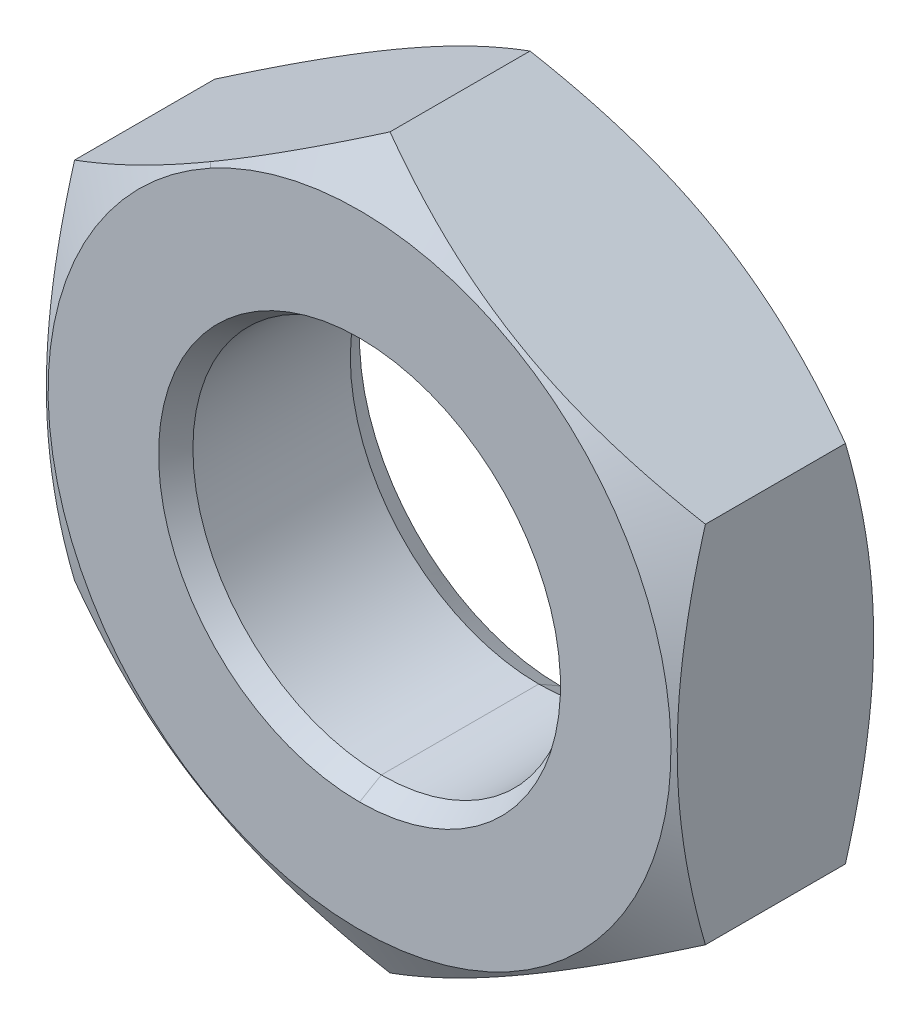
ISO-10303-21;
HEADER;
FILE_DESCRIPTION(('STEP AP214'),'2;1');
FILE_NAME('part.step','',(''),(''),'','','');
FILE_SCHEMA(('AUTOMOTIVE_DESIGN { 1 0 10303 214 1 1 1 1 }'));
ENDSEC;
DATA;
#1=APPLICATION_CONTEXT('core data for automotive mechanical design processes');
#2=APPLICATION_PROTOCOL_DEFINITION('international standard','automotive_design',2000,#1);
#3=PRODUCT_CONTEXT('',#1,'mechanical');
#4=PRODUCT('Part','Part','',(#3));
#5=PRODUCT_RELATED_PRODUCT_CATEGORY('part','',(#4));
#6=PRODUCT_DEFINITION_FORMATION('','',#4);
#7=PRODUCT_DEFINITION_CONTEXT('part definition',#1,'design');
#8=PRODUCT_DEFINITION('design','',#6,#7);
#9=PRODUCT_DEFINITION_SHAPE('','',#8);
#10=(LENGTH_UNIT() NAMED_UNIT(*) SI_UNIT(.MILLI.,.METRE.));
#11=(NAMED_UNIT(*) PLANE_ANGLE_UNIT() SI_UNIT($,.RADIAN.));
#12=(NAMED_UNIT(*) SI_UNIT($,.STERADIAN.) SOLID_ANGLE_UNIT());
#13=UNCERTAINTY_MEASURE_WITH_UNIT(LENGTH_MEASURE(1.E-05),#10,'distance_accuracy_value','');
#14=(GEOMETRIC_REPRESENTATION_CONTEXT(3) GLOBAL_UNCERTAINTY_ASSIGNED_CONTEXT((#13)) GLOBAL_UNIT_ASSIGNED_CONTEXT((#10,
#11,#12)) REPRESENTATION_CONTEXT('',''));
#15=CARTESIAN_POINT('',(0.,0.,0.));
#16=DIRECTION('',(0.,0.,1.));
#17=DIRECTION('',(1.,0.,0.));
#18=AXIS2_PLACEMENT_3D('',#15,#16,#17);
#19=CARTESIAN_POINT('',(0.,0.,-0.8));
#20=DIRECTION('',(0.,0.,1.));
#21=DIRECTION('',(0.479425538604204,-0.877582561890372,0.));
#22=AXIS2_PLACEMENT_3D('',#19,#20,#21);
#23=CONICAL_SURFACE('',#22,2.48001594543,1.0471975512);
#24=CARTESIAN_POINT('',(2.51147367097,1.45,-0.557522093041));
#25=CARTESIAN_POINT('',(2.36141365323,1.53663719164,-0.607542098957));
#26=CARTESIAN_POINT('',(2.2114641529,1.62321057602,-0.651921449576));
#27=CARTESIAN_POINT('',(2.06213640956,1.70942498883,-0.689677750509));
#28=CARTESIAN_POINT('',(1.73319740752,1.89933801021,-0.756854752286));
#29=CARTESIAN_POINT('',(1.40737507889,2.08745161935,-0.785622243016));
#30=CARTESIAN_POINT('',(1.2294714031,2.19016435446,-0.789092730585));
#31=CARTESIAN_POINT('',(0.88963986871,2.38636618232,-0.772120273088));
#32=CARTESIAN_POINT('',(0.546895461987,2.5842497578,-0.712167724603));
#33=CARTESIAN_POINT('',(0.383075275367,2.67883138665,-0.67438001871));
#34=CARTESIAN_POINT('',(0.207665931972,2.78010401827,-0.625244862792));
#35=CARTESIAN_POINT('',(0.0320039125033,2.8815225325,-0.568104794491));
#36=CARTESIAN_POINT('',(0.0213360603002,2.88768161984,-0.56460578976));
#37=CARTESIAN_POINT('',(0.0106683094443,2.89384064867,-0.561078196189));
#38=CARTESIAN_POINT('',(0.,2.9,-0.557522093041));
#39=(BOUNDED_CURVE() B_SPLINE_CURVE(5,(#24,#25,#26,#27,#28,#29,#30,#31,#32,#33,#34,#35,#36,#37,
#38),.UNSPECIFIED.,.F.,.F.) B_SPLINE_CURVE_WITH_KNOTS((6,3,3,3,6),(0.,1.2440758692,
2.75181323299,4.11997717548,4.20842302897),
.UNSPECIFIED.) CURVE() GEOMETRIC_REPRESENTATION_ITEM() RATIONAL_B_SPLINE_CURVE((1.,1.,1.,1.,1.,
1.,1.,1.,1.,1.,1.,1.,1.,1.,1.)) REPRESENTATION_ITEM(''));
#40=CARTESIAN_POINT('',(2.51147367097,1.45,-0.557522093041));
#41=VERTEX_POINT('',#40);
#42=CARTESIAN_POINT('',(0.,2.9,-0.557522093041));
#43=VERTEX_POINT('',#42);
#44=EDGE_CURVE('E259',#41,#43,#39,.T.);
#45=ORIENTED_EDGE('',*,*,#44,.F.);
#46=CARTESIAN_POINT('',(2.51147367097,-1.45,-0.557522093041));
#47=CARTESIAN_POINT('',(2.51147367097,-1.27672561672,-0.607542098958));
#48=CARTESIAN_POINT('',(2.51147367097,-1.10357884796,-0.651921449576));
#49=CARTESIAN_POINT('',(2.51147367097,-0.931150022338,-0.689677750509));
#50=CARTESIAN_POINT('',(2.51147367097,-0.551323979578,-0.756854752285));
#51=CARTESIAN_POINT('',(2.51147367097,-0.17509676129,-0.785622243016));
#52=CARTESIAN_POINT('',(2.51147367097,0.0303287089164,-0.789092730585));
#53=CARTESIAN_POINT('',(2.51147367097,0.422732364635,-0.772120273089));
#54=CARTESIAN_POINT('',(2.51147367097,0.818499515605,-0.712167724603));
#55=CARTESIAN_POINT('',(2.51147367097,1.0076627733,-0.674380018709));
#56=CARTESIAN_POINT('',(2.51147367097,1.21020803655,-0.625244862792));
#57=CARTESIAN_POINT('',(2.51147367097,1.413045065,-0.568104794491));
#58=CARTESIAN_POINT('',(2.51147367097,1.42536323968,-0.56460578976));
#59=CARTESIAN_POINT('',(2.51147367097,1.43768129734,-0.561078196189));
#60=CARTESIAN_POINT('',(2.51147367097,1.45,-0.557522093041));
#61=(BOUNDED_CURVE() B_SPLINE_CURVE(5,(#46,#47,#48,#49,#50,#51,#52,#53,#54,#55,#56,#57,#58,#59,
#60),.UNSPECIFIED.,.F.,.F.) B_SPLINE_CURVE_WITH_KNOTS((6,3,3,3,6),(0.,1.24407586921,
2.75181323301,4.11997717548,4.20842302897),
.UNSPECIFIED.) CURVE() GEOMETRIC_REPRESENTATION_ITEM() RATIONAL_B_SPLINE_CURVE((1.,1.,1.,1.,1.,
1.,1.,1.,1.,1.,1.,1.,1.,1.,1.)) REPRESENTATION_ITEM(''));
#62=CARTESIAN_POINT('',(2.51147367097,-1.45,-0.557522093041));
#63=VERTEX_POINT('',#62);
#64=EDGE_CURVE('E245',#63,#41,#61,.T.);
#65=ORIENTED_EDGE('',*,*,#64,.F.);
#66=CARTESIAN_POINT('',(1.20439996834,-2.20463935407,-0.78143402588));
#67=CARTESIAN_POINT('',(1.36655578818,-2.11101864783,-0.783984908302));
#68=CARTESIAN_POINT('',(1.52860758409,-2.01745799984,-0.776468041161));
#69=CARTESIAN_POINT('',(1.69110113891,-1.92364230223,-0.758832467991));
#70=CARTESIAN_POINT('',(1.95221602436,-1.77288755282,-0.715073455665));
#71=CARTESIAN_POINT('',(2.21530966673,-1.62099036757,-0.648720983586));
#72=CARTESIAN_POINT('',(2.31390385682,-1.56406698539,-0.62094903655));
#73=CARTESIAN_POINT('',(2.41266480523,-1.50704732523,-0.590458381621));
#74=CARTESIAN_POINT('',(2.51147367097,-1.45,-0.557522093041));
#75=(BOUNDED_CURVE() B_SPLINE_CURVE(5,(#66,#67,#68,#69,#70,#71,#72,#73,#74),.UNSPECIFIED.,.F.,
.F.) B_SPLINE_CURVE_WITH_KNOTS((6,3,6),(0.,1.37175235219,2.19092942131),
.UNSPECIFIED.) CURVE() GEOMETRIC_REPRESENTATION_ITEM() RATIONAL_B_SPLINE_CURVE((1.,1.,1.,1.,1.,
1.,1.,1.,1.)) REPRESENTATION_ITEM(''));
#76=CARTESIAN_POINT('',(1.20439996834,-2.20463935407,-0.78143402588));
#77=VERTEX_POINT('',#76);
#78=EDGE_CURVE('E116',#77,#63,#75,.T.);
#79=ORIENTED_EDGE('',*,*,#78,.F.);
#80=DIRECTION('',(0.41519469565414,-0.760008792515256,0.500000000000169));
#81=VECTOR('',#80,1.);
#82=CARTESIAN_POINT('',(1.28965852117,-2.3607040882,-0.678761046521));
#83=LINE('',#82,#81);
#84=CARTESIAN_POINT('',(1.18898298039,-2.17641874692,-0.8));
#85=VERTEX_POINT('',#84);
#86=EDGE_CURVE('E10',#85,#77,#83,.T.);
#87=ORIENTED_EDGE('',*,*,#86,.F.);
#88=CARTESIAN_POINT('',(0.,0.,-0.8));
#89=DIRECTION('',(0.,0.,1.));
#90=DIRECTION('',(1.,0.,0.));
#91=AXIS2_PLACEMENT_3D('',#88,#89,#90);
#92=CIRCLE('',#91,2.48001594543);
#93=CARTESIAN_POINT('',(-1.18898298039,2.17641874692,-0.8));
#94=VERTEX_POINT('',#93);
#95=EDGE_CURVE('E203',#85,#94,#92,.T.);
#96=ORIENTED_EDGE('',*,*,#95,.T.);
#97=DIRECTION('',(-0.41519469565414,0.760008792515256,0.500000000000169));
#98=VECTOR('',#97,1.);
#99=CARTESIAN_POINT('',(-1.28965852117,2.3607040882,-0.678761046521));
#100=LINE('',#99,#98);
#101=CARTESIAN_POINT('',(-1.20439996834,2.20463935407,-0.78143402588));
#102=VERTEX_POINT('',#101);
#103=EDGE_CURVE('E29',#94,#102,#100,.T.);
#104=ORIENTED_EDGE('',*,*,#103,.T.);
#105=CARTESIAN_POINT('',(-1.20439996834,2.20463935407,-0.78143402588));
#106=CARTESIAN_POINT('',(-1.03081716587,2.3048574318,-0.778703384944));
#107=CARTESIAN_POINT('',(-0.857115276609,2.40514426432,-0.764436072395));
#108=CARTESIAN_POINT('',(-0.682719638759,2.50583163278,-0.738710403924));
#109=CARTESIAN_POINT('',(-0.441318736488,2.64520450869,-0.688485383347));
#110=CARTESIAN_POINT('',(-0.198548844611,2.78536777112,-0.620361295045));
#111=CARTESIAN_POINT('',(-0.132409033146,2.82355360907,-0.600567323045));
#112=CARTESIAN_POINT('',(-0.0662152759507,2.86177059261,-0.579593851692));
#113=CARTESIAN_POINT('',(0.,2.9,-0.557522093041));
#114=(BOUNDED_CURVE() B_SPLINE_CURVE(5,(#105,#106,#107,#108,#109,#110,#111,#112,#113),
.UNSPECIFIED.,.F.,.F.) B_SPLINE_CURVE_WITH_KNOTS((6,3,6),(0.,1.46841857306,2.01737777098),
.UNSPECIFIED.) CURVE() GEOMETRIC_REPRESENTATION_ITEM() RATIONAL_B_SPLINE_CURVE((1.,1.,1.,1.,1.,
1.,1.,1.,1.)) REPRESENTATION_ITEM(''));
#115=EDGE_CURVE('E172',#102,#43,#114,.T.);
#116=ORIENTED_EDGE('',*,*,#115,.T.);
#117=EDGE_LOOP('',(#45,#65,#79,#87,#96,#104,#116));
#118=FACE_BOUND('',#117,.T.);
#119=ADVANCED_FACE('F18',(#118),#23,.T.);
#120=CARTESIAN_POINT('',(0.,0.,-0.8));
#121=DIRECTION('',(0.,0.,1.));
#122=DIRECTION('',(0.479425538604204,-0.877582561890372,0.));
#123=AXIS2_PLACEMENT_3D('',#120,#121,#122);
#124=CONICAL_SURFACE('',#123,2.48001594543,1.0471975512);
#125=CARTESIAN_POINT('',(-2.51147367097,-1.45,-0.557522093041));
#126=CARTESIAN_POINT('',(-2.36141365323,-1.53663719164,-0.607542098957));
#127=CARTESIAN_POINT('',(-2.2114641529,-1.62321057602,-0.651921449576));
#128=CARTESIAN_POINT('',(-2.06213640957,-1.70942498883,-0.689677750509));
#129=CARTESIAN_POINT('',(-1.73319740752,-1.89933801021,-0.756854752285));
#130=CARTESIAN_POINT('',(-1.40737507889,-2.08745161935,-0.785622243016));
#131=CARTESIAN_POINT('',(-1.2294714031,-2.19016435446,-0.789092730585));
#132=CARTESIAN_POINT('',(-0.889639868711,-2.38636618232,-0.772120273088));
#133=CARTESIAN_POINT('',(-0.546895461988,-2.5842497578,-0.712167724604));
#134=CARTESIAN_POINT('',(-0.383075275365,-2.67883138665,-0.674380018709));
#135=CARTESIAN_POINT('',(-0.207665931971,-2.78010401828,-0.625244862792));
#136=CARTESIAN_POINT('',(-0.0320039125033,-2.8815225325,-0.568104794491));
#137=CARTESIAN_POINT('',(-0.0213360603002,-2.88768161984,-0.56460578976));
#138=CARTESIAN_POINT('',(-0.0106683094443,-2.89384064867,-0.561078196189));
#139=CARTESIAN_POINT('',(0.,-2.9,-0.557522093041));
#140=(BOUNDED_CURVE() B_SPLINE_CURVE(5,(#125,#126,#127,#128,#129,#130,#131,#132,#133,#134,#135,
#136,#137,#138,#139),.UNSPECIFIED.,.F.,.F.) B_SPLINE_CURVE_WITH_KNOTS((6,3,3,3,6),(0.,
1.24407586921,2.751813233,4.11997717547,4.20842302896),
.UNSPECIFIED.) CURVE() GEOMETRIC_REPRESENTATION_ITEM() RATIONAL_B_SPLINE_CURVE((1.,1.,1.,1.,1.,
1.,1.,1.,1.,1.,1.,1.,1.,1.,1.)) REPRESENTATION_ITEM(''));
#141=CARTESIAN_POINT('',(-2.51147367097,-1.45,-0.557522093041));
#142=VERTEX_POINT('',#141);
#143=CARTESIAN_POINT('',(0.,-2.9,-0.557522093041));
#144=VERTEX_POINT('',#143);
#145=EDGE_CURVE('E211',#142,#144,#140,.T.);
#146=ORIENTED_EDGE('',*,*,#145,.F.);
#147=CARTESIAN_POINT('',(-2.51147367097,1.45,-0.557522093041));
#148=CARTESIAN_POINT('',(-2.51147367097,1.27672561671,-0.607542098958));
#149=CARTESIAN_POINT('',(-2.51147367097,1.10357884795,-0.651921449578));
#150=CARTESIAN_POINT('',(-2.51147367097,0.931150022343,-0.689677750508));
#151=CARTESIAN_POINT('',(-2.51147367097,0.551323979579,-0.756854752286));
#152=CARTESIAN_POINT('',(-2.51147367097,0.175096761286,-0.785622243017));
#153=CARTESIAN_POINT('',(-2.51147367097,-0.0303287089125,-0.789092730585));
#154=CARTESIAN_POINT('',(-2.51147367097,-0.422732364642,-0.772120273089));
#155=CARTESIAN_POINT('',(-2.51147367097,-0.818499515621,-0.7121677246));
#156=CARTESIAN_POINT('',(-2.51147367097,-1.00766277328,-0.674380018713));
#157=CARTESIAN_POINT('',(-2.51147367097,-1.21020803654,-0.625244862794));
#158=CARTESIAN_POINT('',(-2.51147367097,-1.413045065,-0.568104794491));
#159=CARTESIAN_POINT('',(-2.51147367097,-1.42536323968,-0.56460578976));
#160=CARTESIAN_POINT('',(-2.51147367097,-1.43768129734,-0.561078196189));
#161=CARTESIAN_POINT('',(-2.51147367097,-1.45,-0.557522093041));
#162=(BOUNDED_CURVE() B_SPLINE_CURVE(5,(#147,#148,#149,#150,#151,#152,#153,#154,#155,#156,#157,
#158,#159,#160,#161),.UNSPECIFIED.,.F.,.F.) B_SPLINE_CURVE_WITH_KNOTS((6,3,3,3,6),(0.,
1.24407586923,2.75181323304,4.11997717557,4.20842302906),
.UNSPECIFIED.) CURVE() GEOMETRIC_REPRESENTATION_ITEM() RATIONAL_B_SPLINE_CURVE((1.,1.,1.,1.,1.,
1.,1.,1.,1.,1.,1.,1.,1.,1.,1.)) REPRESENTATION_ITEM(''));
#163=CARTESIAN_POINT('',(-2.51147367097,1.45,-0.557522093041));
#164=VERTEX_POINT('',#163);
#165=EDGE_CURVE('E179',#164,#142,#162,.T.);
#166=ORIENTED_EDGE('',*,*,#165,.F.);
#167=CARTESIAN_POINT('',(-1.20439996834,2.20463935407,-0.78143402588));
#168=CARTESIAN_POINT('',(-1.36655578818,2.11101864783,-0.783984908302));
#169=CARTESIAN_POINT('',(-1.52860758409,2.01745799984,-0.776468041161));
#170=CARTESIAN_POINT('',(-1.6911011389,1.92364230223,-0.758832467991));
#171=CARTESIAN_POINT('',(-1.95221602436,1.77288755282,-0.715073455665));
#172=CARTESIAN_POINT('',(-2.21530966673,1.62099036757,-0.648720983586));
#173=CARTESIAN_POINT('',(-2.31390385682,1.56406698539,-0.62094903655));
#174=CARTESIAN_POINT('',(-2.41266480523,1.50704732523,-0.590458381621));
#175=CARTESIAN_POINT('',(-2.51147367097,1.45,-0.557522093041));
#176=(BOUNDED_CURVE() B_SPLINE_CURVE(5,(#167,#168,#169,#170,#171,#172,#173,#174,#175),
.UNSPECIFIED.,.F.,.F.) B_SPLINE_CURVE_WITH_KNOTS((6,3,6),(0.,1.3717523522,2.19092942132),
.UNSPECIFIED.) CURVE() GEOMETRIC_REPRESENTATION_ITEM() RATIONAL_B_SPLINE_CURVE((1.,1.,1.,1.,1.,
1.,1.,1.,1.)) REPRESENTATION_ITEM(''));
#177=EDGE_CURVE('E153',#102,#164,#176,.T.);
#178=ORIENTED_EDGE('',*,*,#177,.F.);
#179=ORIENTED_EDGE('',*,*,#103,.F.);
#180=CARTESIAN_POINT('',(0.,0.,-0.8));
#181=DIRECTION('',(0.,0.,1.));
#182=DIRECTION('',(1.,0.,0.));
#183=AXIS2_PLACEMENT_3D('',#180,#181,#182);
#184=CIRCLE('',#183,2.48001594543);
#185=EDGE_CURVE('E190',#94,#85,#184,.T.);
#186=ORIENTED_EDGE('',*,*,#185,.T.);
#187=ORIENTED_EDGE('',*,*,#86,.T.);
#188=CARTESIAN_POINT('',(1.20439996834,-2.20463935407,-0.78143402588));
#189=CARTESIAN_POINT('',(1.03081716587,-2.3048574318,-0.778703384944));
#190=CARTESIAN_POINT('',(0.857115276612,-2.40514426432,-0.764436072396));
#191=CARTESIAN_POINT('',(0.682719638755,-2.50583163278,-0.738710403923));
#192=CARTESIAN_POINT('',(0.441318736486,-2.64520450869,-0.688485383346));
#193=CARTESIAN_POINT('',(0.19854884461,-2.78536777112,-0.620361295045));
#194=CARTESIAN_POINT('',(0.132409033147,-2.82355360907,-0.600567323046));
#195=CARTESIAN_POINT('',(0.0662152759512,-2.86177059261,-0.579593851692));
#196=CARTESIAN_POINT('',(0.,-2.9,-0.557522093041));
#197=(BOUNDED_CURVE() B_SPLINE_CURVE(5,(#188,#189,#190,#191,#192,#193,#194,#195,#196),
.UNSPECIFIED.,.F.,.F.) B_SPLINE_CURVE_WITH_KNOTS((6,3,6),(0.,1.46841857305,2.01737777097),
.UNSPECIFIED.) CURVE() GEOMETRIC_REPRESENTATION_ITEM() RATIONAL_B_SPLINE_CURVE((1.,1.,1.,1.,1.,
1.,1.,1.,1.)) REPRESENTATION_ITEM(''));
#198=EDGE_CURVE('E237',#77,#144,#197,.T.);
#199=ORIENTED_EDGE('',*,*,#198,.T.);
#200=EDGE_LOOP('',(#146,#166,#178,#179,#186,#187,#199));
#201=FACE_BOUND('',#200,.T.);
#202=ADVANCED_FACE('F341',(#201),#124,.T.);
#203=CARTESIAN_POINT('',(0.,0.,0.8));
#204=DIRECTION('',(0.,0.,-1.));
#205=DIRECTION('',(0.479425538604204,-0.877582561890372,0.));
#206=AXIS2_PLACEMENT_3D('',#203,#204,#205);
#207=CONICAL_SURFACE('',#206,2.48001594543,1.0471975512);
#208=CARTESIAN_POINT('',(2.51147367097,-1.45,0.557522093041));
#209=CARTESIAN_POINT('',(2.51147367097,-1.27672561672,0.607542098957));
#210=CARTESIAN_POINT('',(2.51147367097,-1.10357884796,0.651921449576));
#211=CARTESIAN_POINT('',(2.51147367097,-0.931150022336,0.689677750509));
#212=CARTESIAN_POINT('',(2.51147367097,-0.551323979577,0.756854752286));
#213=CARTESIAN_POINT('',(2.51147367097,-0.175096761288,0.785622243016));
#214=CARTESIAN_POINT('',(2.51147367097,0.0303287089153,0.789092730585));
#215=CARTESIAN_POINT('',(2.51147367097,0.422732364637,0.772120273089));
#216=CARTESIAN_POINT('',(2.51147367097,0.81849951561,0.712167724602));
#217=CARTESIAN_POINT('',(2.51147367097,1.00766277329,0.67438001871));
#218=CARTESIAN_POINT('',(2.51147367097,1.21020803655,0.625244862793));
#219=CARTESIAN_POINT('',(2.51147367097,1.413045065,0.568104794491));
#220=CARTESIAN_POINT('',(2.51147367097,1.42536323968,0.56460578976));
#221=CARTESIAN_POINT('',(2.51147367097,1.43768129734,0.561078196189));
#222=CARTESIAN_POINT('',(2.51147367097,1.45,0.557522093041));
#223=(BOUNDED_CURVE() B_SPLINE_CURVE(5,(#208,#209,#210,#211,#212,#213,#214,#215,#216,#217,#218,
#219,#220,#221,#222),.UNSPECIFIED.,.F.,.F.) B_SPLINE_CURVE_WITH_KNOTS((6,3,3,3,6),(0.,
1.2440758692,2.751813233,4.1199771755,4.20842302899),
.UNSPECIFIED.) CURVE() GEOMETRIC_REPRESENTATION_ITEM() RATIONAL_B_SPLINE_CURVE((1.,1.,1.,1.,1.,
1.,1.,1.,1.,1.,1.,1.,1.,1.,1.)) REPRESENTATION_ITEM(''));
#224=CARTESIAN_POINT('',(2.51147367097,-1.45,0.557522093041));
#225=VERTEX_POINT('',#224);
#226=CARTESIAN_POINT('',(2.51147367097,1.45,0.557522093041));
#227=VERTEX_POINT('',#226);
#228=EDGE_CURVE('E238',#225,#227,#223,.T.);
#229=ORIENTED_EDGE('',*,*,#228,.T.);
#230=CARTESIAN_POINT('',(2.51147367097,1.45,0.557522093041));
#231=CARTESIAN_POINT('',(2.36141365323,1.53663719164,0.607542098958));
#232=CARTESIAN_POINT('',(2.2114641529,1.62321057602,0.651921449577));
#233=CARTESIAN_POINT('',(2.06213640957,1.70942498883,0.689677750508));
#234=CARTESIAN_POINT('',(1.73319740752,1.89933801021,0.756854752285));
#235=CARTESIAN_POINT('',(1.40737507888,2.08745161936,0.785622243016));
#236=CARTESIAN_POINT('',(1.2294714031,2.19016435446,0.789092730585));
#237=CARTESIAN_POINT('',(0.889639868708,2.38636618232,0.772120273088));
#238=CARTESIAN_POINT('',(0.54689546198,2.58424975781,0.712167724602));
#239=CARTESIAN_POINT('',(0.383075275373,2.67883138664,0.674380018711));
#240=CARTESIAN_POINT('',(0.207665931975,2.78010401827,0.625244862793));
#241=CARTESIAN_POINT('',(0.0320039125033,2.8815225325,0.568104794491));
#242=CARTESIAN_POINT('',(0.0213360603002,2.88768161984,0.56460578976));
#243=CARTESIAN_POINT('',(0.0106683094443,2.89384064867,0.561078196189));
#244=CARTESIAN_POINT('',(0.,2.9,0.557522093041));
#245=(BOUNDED_CURVE() B_SPLINE_CURVE(5,(#230,#231,#232,#233,#234,#235,#236,#237,#238,#239,#240,
#241,#242,#243,#244),.UNSPECIFIED.,.F.,.F.) B_SPLINE_CURVE_WITH_KNOTS((6,3,3,3,6),(0.,
1.24407586922,2.75181323302,4.11997717553,4.20842302902),
.UNSPECIFIED.) CURVE() GEOMETRIC_REPRESENTATION_ITEM() RATIONAL_B_SPLINE_CURVE((1.,1.,1.,1.,1.,
1.,1.,1.,1.,1.,1.,1.,1.,1.,1.)) REPRESENTATION_ITEM(''));
#246=CARTESIAN_POINT('',(0.,2.9,0.557522093041));
#247=VERTEX_POINT('',#246);
#248=EDGE_CURVE('E246',#227,#247,#245,.T.);
#249=ORIENTED_EDGE('',*,*,#248,.T.);
#250=CARTESIAN_POINT('',(-1.20439996834,2.20463935407,0.78143402588));
#251=CARTESIAN_POINT('',(-1.03081716587,2.3048574318,0.778703384944));
#252=CARTESIAN_POINT('',(-0.857115276613,2.40514426432,0.764436072396));
#253=CARTESIAN_POINT('',(-0.682719638754,2.50583163278,0.738710403922));
#254=CARTESIAN_POINT('',(-0.441318736485,2.64520450869,0.688485383346));
#255=CARTESIAN_POINT('',(-0.19854884461,2.78536777112,0.620361295045));
#256=CARTESIAN_POINT('',(-0.132409033148,2.82355360907,0.600567323046));
#257=CARTESIAN_POINT('',(-0.0662152759514,2.86177059261,0.579593851692));
#258=CARTESIAN_POINT('',(0.,2.9,0.557522093041));
#259=(BOUNDED_CURVE() B_SPLINE_CURVE(5,(#250,#251,#252,#253,#254,#255,#256,#257,#258),
.UNSPECIFIED.,.F.,.F.) B_SPLINE_CURVE_WITH_KNOTS((6,3,6),(0.,1.46841857304,2.01737777097),
.UNSPECIFIED.) CURVE() GEOMETRIC_REPRESENTATION_ITEM() RATIONAL_B_SPLINE_CURVE((1.,1.,1.,1.,1.,
1.,1.,1.,1.)) REPRESENTATION_ITEM(''));
#260=CARTESIAN_POINT('',(-1.20439996834,2.20463935407,0.78143402588));
#261=VERTEX_POINT('',#260);
#262=EDGE_CURVE('E164',#261,#247,#259,.T.);
#263=ORIENTED_EDGE('',*,*,#262,.F.);
#264=DIRECTION('',(0.41519469565414,-0.760008792515256,0.500000000000169));
#265=VECTOR('',#264,1.);
#266=CARTESIAN_POINT('',(-1.28965852117,2.3607040882,0.678761046521));
#267=LINE('',#266,#265);
#268=CARTESIAN_POINT('',(-1.18898298039,2.17641874692,0.8));
#269=VERTEX_POINT('',#268);
#270=EDGE_CURVE('E43',#261,#269,#267,.T.);
#271=ORIENTED_EDGE('',*,*,#270,.T.);
#272=CARTESIAN_POINT('',(0.,0.,0.8));
#273=DIRECTION('',(0.,0.,1.));
#274=DIRECTION('',(1.,0.,0.));
#275=AXIS2_PLACEMENT_3D('',#272,#273,#274);
#276=CIRCLE('',#275,2.48001594543);
#277=CARTESIAN_POINT('',(1.18898298039,-2.17641874692,0.8));
#278=VERTEX_POINT('',#277);
#279=EDGE_CURVE('E226',#278,#269,#276,.T.);
#280=ORIENTED_EDGE('',*,*,#279,.F.);
#281=DIRECTION('',(-0.41519469565414,0.760008792515256,0.500000000000169));
#282=VECTOR('',#281,1.);
#283=CARTESIAN_POINT('',(1.28965852117,-2.3607040882,0.678761046521));
#284=LINE('',#283,#282);
#285=CARTESIAN_POINT('',(1.20439996834,-2.20463935407,0.78143402588));
#286=VERTEX_POINT('',#285);
#287=EDGE_CURVE('E260',#286,#278,#284,.T.);
#288=ORIENTED_EDGE('',*,*,#287,.F.);
#289=CARTESIAN_POINT('',(1.20439996834,-2.20463935407,0.78143402588));
#290=CARTESIAN_POINT('',(1.36655578817,-2.11101864784,0.783984908302));
#291=CARTESIAN_POINT('',(1.52860758408,-2.01745799984,0.776468041162));
#292=CARTESIAN_POINT('',(1.69110113891,-1.92364230222,0.75883246799));
#293=CARTESIAN_POINT('',(1.95221602437,-1.77288755282,0.715073455664));
#294=CARTESIAN_POINT('',(2.21530966673,-1.62099036757,0.648720983586));
#295=CARTESIAN_POINT('',(2.31390385682,-1.56406698538,0.62094903655));
#296=CARTESIAN_POINT('',(2.41266480524,-1.50704732523,0.590458381621));
#297=CARTESIAN_POINT('',(2.51147367097,-1.45,0.557522093041));
#298=(BOUNDED_CURVE() B_SPLINE_CURVE(5,(#289,#290,#291,#292,#293,#294,#295,#296,#297),
.UNSPECIFIED.,.F.,.F.) B_SPLINE_CURVE_WITH_KNOTS((6,3,6),(0.,1.37175235216,2.19092942127),
.UNSPECIFIED.) CURVE() GEOMETRIC_REPRESENTATION_ITEM() RATIONAL_B_SPLINE_CURVE((1.,1.,1.,1.,1.,
1.,1.,1.,1.)) REPRESENTATION_ITEM(''));
#299=EDGE_CURVE('E127',#286,#225,#298,.T.);
#300=ORIENTED_EDGE('',*,*,#299,.T.);
#301=EDGE_LOOP('',(#229,#249,#263,#271,#280,#288,#300));
#302=FACE_BOUND('',#301,.T.);
#303=ADVANCED_FACE('F409',(#302),#207,.T.);
#304=CARTESIAN_POINT('',(0.,0.,0.8));
#305=DIRECTION('',(0.,0.,-1.));
#306=DIRECTION('',(0.479425538604204,-0.877582561890372,0.));
#307=AXIS2_PLACEMENT_3D('',#304,#305,#306);
#308=CONICAL_SURFACE('',#307,2.48001594543,1.0471975512);
#309=CARTESIAN_POINT('',(-2.51147367097,1.45,0.557522093041));
#310=CARTESIAN_POINT('',(-2.51147367097,1.27672561672,0.607542098957));
#311=CARTESIAN_POINT('',(-2.51147367097,1.10357884796,0.651921449576));
#312=CARTESIAN_POINT('',(-2.51147367097,0.931150022338,0.689677750509));
#313=CARTESIAN_POINT('',(-2.51147367097,0.55132397958,0.756854752285));
#314=CARTESIAN_POINT('',(-2.51147367097,0.175096761293,0.785622243016));
#315=CARTESIAN_POINT('',(-2.51147367097,-0.0303287089202,0.789092730585));
#316=CARTESIAN_POINT('',(-2.51147367097,-0.422732364641,0.772120273088));
#317=CARTESIAN_POINT('',(-2.51147367097,-0.818499515613,0.712167724602));
#318=CARTESIAN_POINT('',(-2.51147367097,-1.00766277329,0.674380018711));
#319=CARTESIAN_POINT('',(-2.51147367097,-1.21020803655,0.625244862793));
#320=CARTESIAN_POINT('',(-2.51147367097,-1.413045065,0.568104794491));
#321=CARTESIAN_POINT('',(-2.51147367097,-1.42536323968,0.56460578976));
#322=CARTESIAN_POINT('',(-2.51147367097,-1.43768129734,0.561078196189));
#323=CARTESIAN_POINT('',(-2.51147367097,-1.45,0.557522093041));
#324=(BOUNDED_CURVE() B_SPLINE_CURVE(5,(#309,#310,#311,#312,#313,#314,#315,#316,#317,#318,#319,
#320,#321,#322,#323),.UNSPECIFIED.,.F.,.F.) B_SPLINE_CURVE_WITH_KNOTS((6,3,3,3,6),(0.,
1.24407586921,2.75181323299,4.11997717549,4.20842302899),
.UNSPECIFIED.) CURVE() GEOMETRIC_REPRESENTATION_ITEM() RATIONAL_B_SPLINE_CURVE((1.,1.,1.,1.,1.,
1.,1.,1.,1.,1.,1.,1.,1.,1.,1.)) REPRESENTATION_ITEM(''));
#325=CARTESIAN_POINT('',(-2.51147367097,1.45,0.557522093041));
#326=VERTEX_POINT('',#325);
#327=CARTESIAN_POINT('',(-2.51147367097,-1.45,0.557522093041));
#328=VERTEX_POINT('',#327);
#329=EDGE_CURVE('E161',#326,#328,#324,.T.);
#330=ORIENTED_EDGE('',*,*,#329,.T.);
#331=CARTESIAN_POINT('',(-2.51147367097,-1.45,0.557522093041));
#332=CARTESIAN_POINT('',(-2.36141365323,-1.53663719164,0.607542098958));
#333=CARTESIAN_POINT('',(-2.2114641529,-1.62321057602,0.651921449577));
#334=CARTESIAN_POINT('',(-2.06213640957,-1.70942498883,0.689677750508));
#335=CARTESIAN_POINT('',(-1.73319740752,-1.89933801021,0.756854752285));
#336=CARTESIAN_POINT('',(-1.40737507889,-2.08745161935,0.785622243016));
#337=CARTESIAN_POINT('',(-1.2294714031,-2.19016435446,0.789092730585));
#338=CARTESIAN_POINT('',(-0.889639868708,-2.38636618232,0.772120273088));
#339=CARTESIAN_POINT('',(-0.546895461983,-2.58424975781,0.712167724602));
#340=CARTESIAN_POINT('',(-0.383075275371,-2.67883138664,0.674380018711));
#341=CARTESIAN_POINT('',(-0.207665931974,-2.78010401827,0.625244862793));
#342=CARTESIAN_POINT('',(-0.0320039125033,-2.8815225325,0.568104794491));
#343=CARTESIAN_POINT('',(-0.0213360603002,-2.88768161984,0.56460578976));
#344=CARTESIAN_POINT('',(-0.0106683094443,-2.89384064867,0.561078196189));
#345=CARTESIAN_POINT('',(0.,-2.9,0.557522093041));
#346=(BOUNDED_CURVE() B_SPLINE_CURVE(5,(#331,#332,#333,#334,#335,#336,#337,#338,#339,#340,#341,
#342,#343,#344,#345),.UNSPECIFIED.,.F.,.F.) B_SPLINE_CURVE_WITH_KNOTS((6,3,3,3,6),(0.,
1.24407586922,2.751813233,4.1199771755,4.20842302899),
.UNSPECIFIED.) CURVE() GEOMETRIC_REPRESENTATION_ITEM() RATIONAL_B_SPLINE_CURVE((1.,1.,1.,1.,1.,
1.,1.,1.,1.,1.,1.,1.,1.,1.,1.)) REPRESENTATION_ITEM(''));
#347=CARTESIAN_POINT('',(0.,-2.9,0.557522093041));
#348=VERTEX_POINT('',#347);
#349=EDGE_CURVE('E217',#328,#348,#346,.T.);
#350=ORIENTED_EDGE('',*,*,#349,.T.);
#351=CARTESIAN_POINT('',(1.20439996834,-2.20463935407,0.78143402588));
#352=CARTESIAN_POINT('',(1.03081716587,-2.3048574318,0.778703384944));
#353=CARTESIAN_POINT('',(0.857115276609,-2.40514426432,0.764436072395));
#354=CARTESIAN_POINT('',(0.682719638759,-2.50583163278,0.738710403923));
#355=CARTESIAN_POINT('',(0.441318736488,-2.64520450869,0.688485383347));
#356=CARTESIAN_POINT('',(0.198548844611,-2.78536777112,0.620361295045));
#357=CARTESIAN_POINT('',(0.132409033147,-2.82355360907,0.600567323045));
#358=CARTESIAN_POINT('',(0.066215275951,-2.86177059261,0.579593851692));
#359=CARTESIAN_POINT('',(0.,-2.9,0.557522093041));
#360=(BOUNDED_CURVE() B_SPLINE_CURVE(5,(#351,#352,#353,#354,#355,#356,#357,#358,#359),
.UNSPECIFIED.,.F.,.F.) B_SPLINE_CURVE_WITH_KNOTS((6,3,6),(0.,1.46841857306,2.01737777098),
.UNSPECIFIED.) CURVE() GEOMETRIC_REPRESENTATION_ITEM() RATIONAL_B_SPLINE_CURVE((1.,1.,1.,1.,1.,
1.,1.,1.,1.)) REPRESENTATION_ITEM(''));
#361=EDGE_CURVE('E338',#286,#348,#360,.T.);
#362=ORIENTED_EDGE('',*,*,#361,.F.);
#363=ORIENTED_EDGE('',*,*,#287,.T.);
#364=CARTESIAN_POINT('',(0.,0.,0.8));
#365=DIRECTION('',(0.,0.,1.));
#366=DIRECTION('',(1.,0.,0.));
#367=AXIS2_PLACEMENT_3D('',#364,#365,#366);
#368=CIRCLE('',#367,2.48001594543);
#369=EDGE_CURVE('E219',#269,#278,#368,.T.);
#370=ORIENTED_EDGE('',*,*,#369,.F.);
#371=ORIENTED_EDGE('',*,*,#270,.F.);
#372=CARTESIAN_POINT('',(-1.20439996834,2.20463935407,0.78143402588));
#373=CARTESIAN_POINT('',(-1.36655578817,2.11101864783,0.783984908302));
#374=CARTESIAN_POINT('',(-1.52860758409,2.01745799984,0.776468041161));
#375=CARTESIAN_POINT('',(-1.69110113891,1.92364230222,0.758832467991));
#376=CARTESIAN_POINT('',(-1.95221602436,1.77288755282,0.715073455665));
#377=CARTESIAN_POINT('',(-2.21530966673,1.62099036757,0.648720983586));
#378=CARTESIAN_POINT('',(-2.31390385682,1.56406698539,0.62094903655));
#379=CARTESIAN_POINT('',(-2.41266480523,1.50704732523,0.590458381621));
#380=CARTESIAN_POINT('',(-2.51147367097,1.45,0.557522093041));
#381=(BOUNDED_CURVE() B_SPLINE_CURVE(5,(#372,#373,#374,#375,#376,#377,#378,#379,#380),
.UNSPECIFIED.,.F.,.F.) B_SPLINE_CURVE_WITH_KNOTS((6,3,6),(0.,1.37175235218,2.1909294213),
.UNSPECIFIED.) CURVE() GEOMETRIC_REPRESENTATION_ITEM() RATIONAL_B_SPLINE_CURVE((1.,1.,1.,1.,1.,
1.,1.,1.,1.)) REPRESENTATION_ITEM(''));
#382=EDGE_CURVE('E158',#261,#326,#381,.T.);
#383=ORIENTED_EDGE('',*,*,#382,.T.);
#384=EDGE_LOOP('',(#330,#350,#362,#363,#370,#371,#383));
#385=FACE_BOUND('',#384,.T.);
#386=ADVANCED_FACE('F159',(#385),#308,.T.);
#387=CARTESIAN_POINT('',(0.,2.9,0.));
#388=DIRECTION('',(-0.50000000000019,0.866025403784329,0.));
#389=DIRECTION('',(0.,0.,1.));
#390=AXIS2_PLACEMENT_3D('',#387,#388,#389);
#391=PLANE('',#390);
#392=ORIENTED_EDGE('',*,*,#115,.F.);
#393=ORIENTED_EDGE('',*,*,#177,.T.);
#394=DIRECTION('',(0.,0.,1.));
#395=VECTOR('',#394,1.);
#396=CARTESIAN_POINT('',(-2.51147367097,1.45,0.));
#397=LINE('',#396,#395);
#398=EDGE_CURVE('E166',#164,#326,#397,.T.);
#399=ORIENTED_EDGE('',*,*,#398,.T.);
#400=ORIENTED_EDGE('',*,*,#382,.F.);
#401=ORIENTED_EDGE('',*,*,#262,.T.);
#402=DIRECTION('',(0.,0.,1.));
#403=VECTOR('',#402,1.);
#404=CARTESIAN_POINT('',(0.,2.9,0.));
#405=LINE('',#404,#403);
#406=EDGE_CURVE('E255',#43,#247,#405,.T.);
#407=ORIENTED_EDGE('',*,*,#406,.F.);
#408=EDGE_LOOP('',(#392,#393,#399,#400,#401,#407));
#409=FACE_BOUND('',#408,.T.);
#410=ADVANCED_FACE('F167',(#409),#391,.T.);
#411=CARTESIAN_POINT('',(-2.51147367097,1.45,0.));
#412=DIRECTION('',(-1.,0.,0.));
#413=DIRECTION('',(0.,1.,0.));
#414=AXIS2_PLACEMENT_3D('',#411,#412,#413);
#415=PLANE('',#414);
#416=ORIENTED_EDGE('',*,*,#165,.T.);
#417=DIRECTION('',(0.,0.,1.));
#418=VECTOR('',#417,1.);
#419=CARTESIAN_POINT('',(-2.51147367097,-1.45,0.));
#420=LINE('',#419,#418);
#421=EDGE_CURVE('E176',#142,#328,#420,.T.);
#422=ORIENTED_EDGE('',*,*,#421,.T.);
#423=ORIENTED_EDGE('',*,*,#329,.F.);
#424=ORIENTED_EDGE('',*,*,#398,.F.);
#425=EDGE_LOOP('',(#416,#422,#423,#424));
#426=FACE_BOUND('',#425,.T.);
#427=ADVANCED_FACE('F174',(#426),#415,.T.);
#428=CARTESIAN_POINT('',(-2.51147367097,-1.45,0.));
#429=DIRECTION('',(-0.50000000000019,-0.866025403784329,0.));
#430=DIRECTION('',(-0.866025403784329,0.50000000000019,0.));
#431=AXIS2_PLACEMENT_3D('',#428,#429,#430);
#432=PLANE('',#431);
#433=ORIENTED_EDGE('',*,*,#145,.T.);
#434=DIRECTION('',(0.,0.,1.));
#435=VECTOR('',#434,1.);
#436=CARTESIAN_POINT('',(0.,-2.9,0.));
#437=LINE('',#436,#435);
#438=EDGE_CURVE('E218',#144,#348,#437,.T.);
#439=ORIENTED_EDGE('',*,*,#438,.T.);
#440=ORIENTED_EDGE('',*,*,#349,.F.);
#441=ORIENTED_EDGE('',*,*,#421,.F.);
#442=EDGE_LOOP('',(#433,#439,#440,#441));
#443=FACE_BOUND('',#442,.T.);
#444=ADVANCED_FACE('F332',(#443),#432,.T.);
#445=CARTESIAN_POINT('',(0.,-2.9,0.));
#446=DIRECTION('',(0.50000000000019,-0.866025403784329,0.));
#447=DIRECTION('',(0.,0.,-1.));
#448=AXIS2_PLACEMENT_3D('',#445,#446,#447);
#449=PLANE('',#448);
#450=ORIENTED_EDGE('',*,*,#198,.F.);
#451=ORIENTED_EDGE('',*,*,#78,.T.);
#452=DIRECTION('',(0.,0.,1.));
#453=VECTOR('',#452,1.);
#454=CARTESIAN_POINT('',(2.51147367097,-1.45,0.));
#455=LINE('',#454,#453);
#456=EDGE_CURVE('E234',#63,#225,#455,.T.);
#457=ORIENTED_EDGE('',*,*,#456,.T.);
#458=ORIENTED_EDGE('',*,*,#299,.F.);
#459=ORIENTED_EDGE('',*,*,#361,.T.);
#460=ORIENTED_EDGE('',*,*,#438,.F.);
#461=EDGE_LOOP('',(#450,#451,#457,#458,#459,#460));
#462=FACE_BOUND('',#461,.T.);
#463=ADVANCED_FACE('F336',(#462),#449,.T.);
#464=CARTESIAN_POINT('',(2.51147367097,-1.45,0.));
#465=DIRECTION('',(1.,0.,0.));
#466=DIRECTION('',(0.,1.,0.));
#467=AXIS2_PLACEMENT_3D('',#464,#465,#466);
#468=PLANE('',#467);
#469=ORIENTED_EDGE('',*,*,#64,.T.);
#470=DIRECTION('',(0.,0.,1.));
#471=VECTOR('',#470,1.);
#472=CARTESIAN_POINT('',(2.51147367097,1.45,0.));
#473=LINE('',#472,#471);
#474=EDGE_CURVE('E241',#41,#227,#473,.T.);
#475=ORIENTED_EDGE('',*,*,#474,.T.);
#476=ORIENTED_EDGE('',*,*,#228,.F.);
#477=ORIENTED_EDGE('',*,*,#456,.F.);
#478=EDGE_LOOP('',(#469,#475,#476,#477));
#479=FACE_BOUND('',#478,.T.);
#480=ADVANCED_FACE('F416',(#479),#468,.T.);
#481=CARTESIAN_POINT('',(2.51147367097,1.45,0.));
#482=DIRECTION('',(0.50000000000019,0.866025403784329,0.));
#483=DIRECTION('',(0.,0.,-1.));
#484=AXIS2_PLACEMENT_3D('',#481,#482,#483);
#485=PLANE('',#484);
#486=ORIENTED_EDGE('',*,*,#44,.T.);
#487=ORIENTED_EDGE('',*,*,#406,.T.);
#488=ORIENTED_EDGE('',*,*,#248,.F.);
#489=ORIENTED_EDGE('',*,*,#474,.F.);
#490=EDGE_LOOP('',(#486,#487,#488,#489));
#491=FACE_BOUND('',#490,.T.);
#492=ADVANCED_FACE('F419',(#491),#485,.T.);
#493=CARTESIAN_POINT('',(0.,0.,0.8));
#494=DIRECTION('',(0.,0.,1.));
#495=DIRECTION('',(1.,0.,0.));
#496=AXIS2_PLACEMENT_3D('',#493,#494,#495);
#497=PLANE('',#496);
#498=CARTESIAN_POINT('',(0.,0.,0.8));
#499=DIRECTION('',(-2.30952851906E-13,0.,1.));
#500=DIRECTION('',(1.,0.,2.30952851906E-13));
#501=AXIS2_PLACEMENT_3D('',#498,#499,#500);
#502=CIRCLE('',#501,1.6);
#503=CARTESIAN_POINT('',(-4.35211600987E-07,-1.59998532199,0.8));
#504=VERTEX_POINT('',#503);
#505=CARTESIAN_POINT('',(0.,1.6,0.8));
#506=VERTEX_POINT('',#505);
#507=EDGE_CURVE('E287',#504,#506,#502,.T.);
#508=ORIENTED_EDGE('',*,*,#507,.F.);
#509=CARTESIAN_POINT('',(-4.13336032069E-13,0.,0.8));
#510=DIRECTION('',(-2.38319175599E-12,0.,1.));
#511=DIRECTION('',(1.,0.,2.38319175599E-12));
#512=AXIS2_PLACEMENT_3D('',#509,#510,#511);
#513=CIRCLE('',#512,1.6);
#514=EDGE_CURVE('E254',#506,#504,#513,.T.);
#515=ORIENTED_EDGE('',*,*,#514,.F.);
#516=EDGE_LOOP('',(#508,#515));
#517=FACE_BOUND('',#516,.T.);
#518=ORIENTED_EDGE('',*,*,#369,.T.);
#519=ORIENTED_EDGE('',*,*,#279,.T.);
#520=EDGE_LOOP('',(#518,#519));
#521=FACE_BOUND('',#520,.T.);
#522=ADVANCED_FACE('F314',(#517,#521),#497,.T.);
#523=CARTESIAN_POINT('',(0.,0.,-0.8));
#524=DIRECTION('',(0.,0.,1.));
#525=DIRECTION('',(1.,0.,0.));
#526=AXIS2_PLACEMENT_3D('',#523,#524,#525);
#527=PLANE('',#526);
#528=CARTESIAN_POINT('',(-4.13336032069E-13,0.,-0.8));
#529=DIRECTION('',(2.38319175599E-12,0.,1.));
#530=DIRECTION('',(1.,0.,-2.38319175599E-12));
#531=AXIS2_PLACEMENT_3D('',#528,#529,#530);
#532=CIRCLE('',#531,1.6);
#533=CARTESIAN_POINT('',(0.,1.6,-0.8));
#534=VERTEX_POINT('',#533);
#535=CARTESIAN_POINT('',(-4.35211600987E-07,-1.59998532199,-0.8));
#536=VERTEX_POINT('',#535);
#537=EDGE_CURVE('E276',#534,#536,#532,.T.);
#538=ORIENTED_EDGE('',*,*,#537,.T.);
#539=CARTESIAN_POINT('',(0.,0.,-0.8));
#540=DIRECTION('',(2.30952851906E-13,0.,1.));
#541=DIRECTION('',(1.,0.,-2.30952851906E-13));
#542=AXIS2_PLACEMENT_3D('',#539,#540,#541);
#543=CIRCLE('',#542,1.6);
#544=EDGE_CURVE('E102',#536,#534,#543,.T.);
#545=ORIENTED_EDGE('',*,*,#544,.T.);
#546=EDGE_LOOP('',(#538,#545));
#547=FACE_BOUND('',#546,.T.);
#548=ORIENTED_EDGE('',*,*,#95,.F.);
#549=ORIENTED_EDGE('',*,*,#185,.F.);
#550=EDGE_LOOP('',(#548,#549));
#551=FACE_BOUND('',#550,.T.);
#552=ADVANCED_FACE('F425',(#547,#551),#527,.F.);
#553=CARTESIAN_POINT('',(4.66436086699E-13,2.10102152139E-13,0.97128129211));
#554=DIRECTION('',(-2.92312662191082E-13,-1.31475874779518E-13,-1.));
#555=DIRECTION('',(-0.291009693535041,-0.956720104455134,2.10851430893029E-13));
#556=AXIS2_PLACEMENT_3D('',#553,#554,#555);
#557=CONICAL_SURFACE('',#556,0.577350269189227,0.523598775598);
#558=DIRECTION('',(2.063932114409E-12,0.499999999999757,0.866025403784579));
#559=VECTOR('',#558,1.);
#560=CARTESIAN_POINT('',(-2.07030857845E-13,-1.55,-0.713397459622));
#561=LINE('',#560,#559);
#562=CARTESIAN_POINT('',(0.,-1.5,-0.626794919243));
#563=VERTEX_POINT('',#562);
#564=EDGE_CURVE('E249',#536,#563,#561,.T.);
#565=ORIENTED_EDGE('',*,*,#564,.T.);
#566=CARTESIAN_POINT('',(0.,0.,-0.626794919243));
#567=DIRECTION('',(0.,0.,1.));
#568=DIRECTION('',(1.,0.,0.));
#569=AXIS2_PLACEMENT_3D('',#566,#567,#568);
#570=CIRCLE('',#569,1.5);
#571=CARTESIAN_POINT('',(0.,1.5,-0.626794919243));
#572=VERTEX_POINT('',#571);
#573=EDGE_CURVE('E200',#563,#572,#570,.T.);
#574=ORIENTED_EDGE('',*,*,#573,.T.);
#575=DIRECTION('',(2.06371956561078E-12,-0.50000000000019,0.866025403784329));
#576=VECTOR('',#575,1.);
#577=CARTESIAN_POINT('',(-2.06371956562E-13,1.55,-0.713397459622));
#578=LINE('',#577,#576);
#579=EDGE_CURVE('E210',#534,#572,#578,.T.);
#580=ORIENTED_EDGE('',*,*,#579,.F.);
#581=ORIENTED_EDGE('',*,*,#544,.F.);
#582=EDGE_LOOP('',(#565,#574,#580,#581));
#583=FACE_BOUND('',#582,.T.);
#584=ADVANCED_FACE('F428',(#583),#557,.F.);
#585=CARTESIAN_POINT('',(3.80796694083E-12,-4.91686547909E-13,0.97128129211));
#586=DIRECTION('',(-2.38319175599E-12,3.07708978653616E-13,-1.));
#587=DIRECTION('',(2.58392482758E-13,1.,3.07708978653E-13));
#588=AXIS2_PLACEMENT_3D('',#585,#586,#587);
#589=CONICAL_SURFACE('',#588,0.577350269189227,0.523598775598);
#590=ORIENTED_EDGE('',*,*,#579,.T.);
#591=CARTESIAN_POINT('',(0.,0.,-0.626794919243));
#592=DIRECTION('',(0.,0.,1.));
#593=DIRECTION('',(1.,0.,0.));
#594=AXIS2_PLACEMENT_3D('',#591,#592,#593);
#595=CIRCLE('',#594,1.5);
#596=EDGE_CURVE('E206',#572,#563,#595,.T.);
#597=ORIENTED_EDGE('',*,*,#596,.T.);
#598=ORIENTED_EDGE('',*,*,#564,.F.);
#599=ORIENTED_EDGE('',*,*,#537,.F.);
#600=EDGE_LOOP('',(#590,#597,#598,#599));
#601=FACE_BOUND('',#600,.T.);
#602=ADVANCED_FACE('F20',(#601),#589,.F.);
#603=CARTESIAN_POINT('',(0.,0.,0.));
#604=DIRECTION('',(0.,0.,1.));
#605=DIRECTION('',(0.,1.,0.));
#606=AXIS2_PLACEMENT_3D('',#603,#604,#605);
#607=CYLINDRICAL_SURFACE('',#606,1.5);
#608=ORIENTED_EDGE('',*,*,#596,.F.);
#609=DIRECTION('',(0.,0.,1.));
#610=VECTOR('',#609,1.);
#611=CARTESIAN_POINT('',(0.,1.5,0.));
#612=LINE('',#611,#610);
#613=CARTESIAN_POINT('',(0.,1.5,0.626794919243));
#614=VERTEX_POINT('',#613);
#615=EDGE_CURVE('E199',#572,#614,#612,.T.);
#616=ORIENTED_EDGE('',*,*,#615,.T.);
#617=CARTESIAN_POINT('',(0.,0.,0.626794919244));
#618=DIRECTION('',(-2.38319175599E-12,0.,1.));
#619=DIRECTION('',(1.,0.,2.38319175599E-12));
#620=AXIS2_PLACEMENT_3D('',#617,#618,#619);
#621=CIRCLE('',#620,1.5);
#622=CARTESIAN_POINT('',(0.,-1.5,0.626794919243));
#623=VERTEX_POINT('',#622);
#624=EDGE_CURVE('E291',#614,#623,#621,.T.);
#625=ORIENTED_EDGE('',*,*,#624,.T.);
#626=DIRECTION('',(0.,0.,1.));
#627=VECTOR('',#626,1.);
#628=CARTESIAN_POINT('',(0.,-1.5,0.));
#629=LINE('',#628,#627);
#630=EDGE_CURVE('E192',#563,#623,#629,.T.);
#631=ORIENTED_EDGE('',*,*,#630,.F.);
#632=EDGE_LOOP('',(#608,#616,#625,#631));
#633=FACE_BOUND('',#632,.T.);
#634=ADVANCED_FACE('F387',(#633),#607,.F.);
#635=CARTESIAN_POINT('',(0.,0.,0.));
#636=DIRECTION('',(0.,0.,1.));
#637=DIRECTION('',(0.,1.,0.));
#638=AXIS2_PLACEMENT_3D('',#635,#636,#637);
#639=CYLINDRICAL_SURFACE('',#638,1.5);
#640=ORIENTED_EDGE('',*,*,#573,.F.);
#641=ORIENTED_EDGE('',*,*,#630,.T.);
#642=CARTESIAN_POINT('',(0.,0.,0.626794919243));
#643=DIRECTION('',(-2.30952851906E-13,0.,1.));
#644=DIRECTION('',(1.,0.,2.30952851906E-13));
#645=AXIS2_PLACEMENT_3D('',#642,#643,#644);
#646=CIRCLE('',#645,1.5);
#647=EDGE_CURVE('E266',#623,#614,#646,.T.);
#648=ORIENTED_EDGE('',*,*,#647,.T.);
#649=ORIENTED_EDGE('',*,*,#615,.F.);
#650=EDGE_LOOP('',(#640,#641,#648,#649));
#651=FACE_BOUND('',#650,.T.);
#652=ADVANCED_FACE('F392',(#651),#639,.F.);
#653=CARTESIAN_POINT('',(4.66436086699E-13,2.10102152139E-13,-0.97128129211));
#654=DIRECTION('',(-2.92312662191082E-13,-1.31475874779518E-13,1.));
#655=DIRECTION('',(-0.291009693535041,-0.956720104455134,-2.10851430893029E-13));
#656=AXIS2_PLACEMENT_3D('',#653,#654,#655);
#657=CONICAL_SURFACE('',#656,0.577350269189227,0.523598775598);
#658=DIRECTION('',(-1.36006807843933E-07,-0.499999999999752,0.866025403784571));
#659=VECTOR('',#658,1.);
#660=CARTESIAN_POINT('',(-4.21614913156E-07,-1.55,0.713397459622));
#661=LINE('',#660,#659);
#662=EDGE_CURVE('E294',#623,#504,#661,.T.);
#663=ORIENTED_EDGE('',*,*,#662,.T.);
#664=ORIENTED_EDGE('',*,*,#507,.T.);
#665=DIRECTION('',(-1.93470239829074E-12,0.50000000000019,0.866025403784329));
#666=VECTOR('',#665,1.);
#667=CARTESIAN_POINT('',(1.9358126213E-13,1.55,0.713397459622));
#668=LINE('',#667,#666);
#669=EDGE_CURVE('E250',#614,#506,#668,.T.);
#670=ORIENTED_EDGE('',*,*,#669,.F.);
#671=ORIENTED_EDGE('',*,*,#647,.F.);
#672=EDGE_LOOP('',(#663,#664,#670,#671));
#673=FACE_BOUND('',#672,.T.);
#674=ADVANCED_FACE('F394',(#673),#657,.F.);
#675=CARTESIAN_POINT('',(3.80796694083E-12,-4.91686547909E-13,-0.97128129211));
#676=DIRECTION('',(-2.38319175599E-12,3.07708978653616E-13,1.));
#677=DIRECTION('',(2.58392482758E-13,1.,-3.07708978653E-13));
#678=AXIS2_PLACEMENT_3D('',#675,#676,#677);
#679=CONICAL_SURFACE('',#678,0.577350269189227,0.523598775598);
#680=ORIENTED_EDGE('',*,*,#669,.T.);
#681=ORIENTED_EDGE('',*,*,#514,.T.);
#682=ORIENTED_EDGE('',*,*,#662,.F.);
#683=ORIENTED_EDGE('',*,*,#624,.F.);
#684=EDGE_LOOP('',(#680,#681,#682,#683));
#685=FACE_BOUND('',#684,.T.);
#686=ADVANCED_FACE('F307',(#685),#679,.F.);
#687=CLOSED_SHELL('',(#119,#202,#303,#386,#410,#427,#444,#463,#480,#492,#522,#552,#584,#602,
#634,#652,#674,#686));
#688=MANIFOLD_SOLID_BREP('B1',#687);
#689=ADVANCED_BREP_SHAPE_REPRESENTATION('',(#18,#688),#14);
#690=SHAPE_DEFINITION_REPRESENTATION(#9,#689);
ENDSEC;
END-ISO-10303-21;
